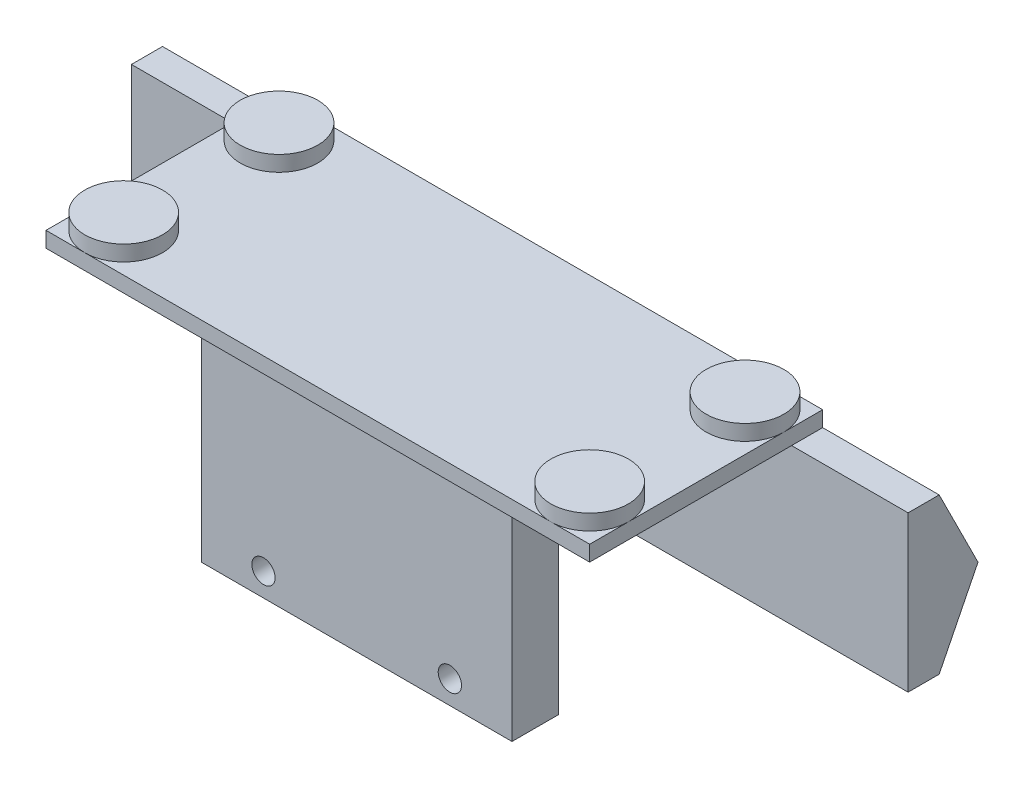
ISO-10303-21;
HEADER;
FILE_DESCRIPTION(('STEP AP214'),'2;1');
FILE_NAME('part.step','',(''),(''),'','','');
FILE_SCHEMA(('AUTOMOTIVE_DESIGN { 1 0 10303 214 1 1 1 1 }'));
ENDSEC;
DATA;
#1=APPLICATION_CONTEXT('core data for automotive mechanical design processes');
#2=APPLICATION_PROTOCOL_DEFINITION('international standard','automotive_design',2000,#1);
#3=PRODUCT_CONTEXT('',#1,'mechanical');
#4=PRODUCT('Part','Part','',(#3));
#5=PRODUCT_RELATED_PRODUCT_CATEGORY('part','',(#4));
#6=PRODUCT_DEFINITION_FORMATION('','',#4);
#7=PRODUCT_DEFINITION_CONTEXT('part definition',#1,'design');
#8=PRODUCT_DEFINITION('design','',#6,#7);
#9=PRODUCT_DEFINITION_SHAPE('','',#8);
#10=(LENGTH_UNIT() NAMED_UNIT(*) SI_UNIT(.MILLI.,.METRE.));
#11=(NAMED_UNIT(*) PLANE_ANGLE_UNIT() SI_UNIT($,.RADIAN.));
#12=(NAMED_UNIT(*) SI_UNIT($,.STERADIAN.) SOLID_ANGLE_UNIT());
#13=UNCERTAINTY_MEASURE_WITH_UNIT(LENGTH_MEASURE(1.E-05),#10,'distance_accuracy_value','');
#14=(GEOMETRIC_REPRESENTATION_CONTEXT(3) GLOBAL_UNCERTAINTY_ASSIGNED_CONTEXT((#13)) GLOBAL_UNIT_ASSIGNED_CONTEXT((#10,
#11,#12)) REPRESENTATION_CONTEXT('',''));
#15=CARTESIAN_POINT('',(0.,0.,0.));
#16=DIRECTION('',(0.,0.,1.));
#17=DIRECTION('',(1.,0.,0.));
#18=AXIS2_PLACEMENT_3D('',#15,#16,#17);
#19=CARTESIAN_POINT('',(85.,-20.,-26.));
#20=DIRECTION('',(0.,-1.,0.));
#21=DIRECTION('',(0.,0.,-1.));
#22=AXIS2_PLACEMENT_3D('',#19,#20,#21);
#23=PLANE('',#22);
#24=DIRECTION('',(0.,0.,1.));
#25=VECTOR('',#24,1.);
#26=CARTESIAN_POINT('',(48.076696830622,-20.,-35.001));
#27=LINE('',#26,#25);
#28=CARTESIAN_POINT('',(48.076696830622,-20.,-26.));
#29=VERTEX_POINT('',#28);
#30=CARTESIAN_POINT('',(48.076696830622,-20.,-30.));
#31=VERTEX_POINT('',#30);
#32=EDGE_CURVE('E191',#29,#31,#27,.F.);
#33=ORIENTED_EDGE('',*,*,#32,.T.);
#34=DIRECTION('',(-1.,0.,0.));
#35=VECTOR('',#34,1.);
#36=CARTESIAN_POINT('',(85.,-20.,-30.));
#37=LINE('',#36,#35);
#38=CARTESIAN_POINT('',(85.,-20.,-30.));
#39=VERTEX_POINT('',#38);
#40=EDGE_CURVE('E202',#39,#31,#37,.T.);
#41=ORIENTED_EDGE('',*,*,#40,.F.);
#42=DIRECTION('',(0.,0.,-1.));
#43=VECTOR('',#42,1.);
#44=CARTESIAN_POINT('',(85.,-20.,-26.));
#45=LINE('',#44,#43);
#46=CARTESIAN_POINT('',(85.,-20.,-26.));
#47=VERTEX_POINT('',#46);
#48=EDGE_CURVE('E231',#47,#39,#45,.T.);
#49=ORIENTED_EDGE('',*,*,#48,.F.);
#50=DIRECTION('',(-1.,0.,0.));
#51=VECTOR('',#50,1.);
#52=CARTESIAN_POINT('',(85.,-20.,-26.));
#53=LINE('',#52,#51);
#54=EDGE_CURVE('E205',#47,#29,#53,.T.);
#55=ORIENTED_EDGE('',*,*,#54,.T.);
#56=EDGE_LOOP('',(#33,#41,#49,#55));
#57=FACE_BOUND('',#56,.T.);
#58=ADVANCED_FACE('F43',(#57),#23,.T.);
#59=CARTESIAN_POINT('',(85.,-10.,-35.));
#60=DIRECTION('',(0.,-0.447213595499958,-0.894427190999916));
#61=DIRECTION('',(0.,0.894427190999916,-0.447213595499958));
#62=AXIS2_PLACEMENT_3D('',#59,#60,#61);
#63=PLANE('',#62);
#64=CARTESIAN_POINT('',(35.,-15.,-32.5));
#65=DIRECTION('',(0.,-0.447213595499958,-0.894427190999916));
#66=DIRECTION('',(0.,-0.894427190999916,0.447213595499958));
#67=AXIS2_PLACEMENT_3D('',#64,#65,#66);
#68=ELLIPSE('',#67,15.6524758424985,14.);
#69=CARTESIAN_POINT('',(21.923303169378,-10.,-35.));
#70=VERTEX_POINT('',#69);
#71=CARTESIAN_POINT('',(21.923303169378,-20.,-30.));
#72=VERTEX_POINT('',#71);
#73=EDGE_CURVE('E62',#70,#72,#68,.F.);
#74=ORIENTED_EDGE('',*,*,#73,.T.);
#75=CARTESIAN_POINT('',(-15.,-20.,-30.));
#76=VERTEX_POINT('',#75);
#77=EDGE_CURVE('E215',#72,#76,#37,.T.);
#78=ORIENTED_EDGE('',*,*,#77,.T.);
#79=DIRECTION('',(0.,-0.894427190999916,0.447213595499958));
#80=VECTOR('',#79,1.);
#81=CARTESIAN_POINT('',(-15.,-10.,-35.));
#82=LINE('',#81,#80);
#83=CARTESIAN_POINT('',(-15.,-10.,-35.));
#84=VERTEX_POINT('',#83);
#85=EDGE_CURVE('E356',#84,#76,#82,.T.);
#86=ORIENTED_EDGE('',*,*,#85,.F.);
#87=DIRECTION('',(-1.,0.,0.));
#88=VECTOR('',#87,1.);
#89=CARTESIAN_POINT('',(85.,-10.,-35.));
#90=LINE('',#89,#88);
#91=EDGE_CURVE('E351',#70,#84,#90,.T.);
#92=ORIENTED_EDGE('',*,*,#91,.F.);
#93=EDGE_LOOP('',(#74,#78,#86,#92));
#94=FACE_BOUND('',#93,.T.);
#95=ADVANCED_FACE('F506',(#94),#63,.T.);
#96=CARTESIAN_POINT('',(0.,0.,0.));
#97=DIRECTION('',(0.,-1.,0.));
#98=DIRECTION('',(0.,0.,-1.));
#99=AXIS2_PLACEMENT_3D('',#96,#97,#98);
#100=PLANE('',#99);
#101=DIRECTION('',(0.,0.,1.));
#102=VECTOR('',#101,1.);
#103=CARTESIAN_POINT('',(0.,0.,-30.));
#104=LINE('',#103,#102);
#105=CARTESIAN_POINT('',(0.,0.,-26.));
#106=VERTEX_POINT('',#105);
#107=CARTESIAN_POINT('',(0.,0.,0.));
#108=VERTEX_POINT('',#107);
#109=EDGE_CURVE('E302',#106,#108,#104,.T.);
#110=ORIENTED_EDGE('',*,*,#109,.F.);
#111=DIRECTION('',(1.,0.,0.));
#112=VECTOR('',#111,1.);
#113=CARTESIAN_POINT('',(85.,0.,-26.));
#114=LINE('',#113,#112);
#115=CARTESIAN_POINT('',(70.,0.,-26.));
#116=VERTEX_POINT('',#115);
#117=EDGE_CURVE('E11',#106,#116,#114,.T.);
#118=ORIENTED_EDGE('',*,*,#117,.T.);
#119=DIRECTION('',(0.,0.,-1.));
#120=VECTOR('',#119,1.);
#121=CARTESIAN_POINT('',(70.,0.,-30.));
#122=LINE('',#121,#120);
#123=CARTESIAN_POINT('',(70.,0.,0.));
#124=VERTEX_POINT('',#123);
#125=EDGE_CURVE('E306',#124,#116,#122,.T.);
#126=ORIENTED_EDGE('',*,*,#125,.F.);
#127=DIRECTION('',(1.,0.,0.));
#128=VECTOR('',#127,1.);
#129=CARTESIAN_POINT('',(0.,0.,0.));
#130=LINE('',#129,#128);
#131=EDGE_CURVE('E301',#108,#124,#130,.T.);
#132=ORIENTED_EDGE('',*,*,#131,.F.);
#133=EDGE_LOOP('',(#110,#118,#126,#132));
#134=FACE_BOUND('',#133,.T.);
#135=DIRECTION('',(0.,0.,-1.));
#136=VECTOR('',#135,1.);
#137=CARTESIAN_POINT('',(15.,0.,-5.));
#138=LINE('',#137,#136);
#139=CARTESIAN_POINT('',(15.,0.,-5.));
#140=VERTEX_POINT('',#139);
#141=CARTESIAN_POINT('',(15.,0.,-11.));
#142=VERTEX_POINT('',#141);
#143=EDGE_CURVE('E70',#140,#142,#138,.T.);
#144=ORIENTED_EDGE('',*,*,#143,.F.);
#145=DIRECTION('',(-1.,0.,0.));
#146=VECTOR('',#145,1.);
#147=CARTESIAN_POINT('',(15.,0.,-5.));
#148=LINE('',#147,#146);
#149=CARTESIAN_POINT('',(55.,0.,-5.));
#150=VERTEX_POINT('',#149);
#151=EDGE_CURVE('E459',#150,#140,#148,.T.);
#152=ORIENTED_EDGE('',*,*,#151,.F.);
#153=DIRECTION('',(0.,0.,-1.));
#154=VECTOR('',#153,1.);
#155=CARTESIAN_POINT('',(55.,0.,-5.));
#156=LINE('',#155,#154);
#157=CARTESIAN_POINT('',(55.,0.,-11.));
#158=VERTEX_POINT('',#157);
#159=EDGE_CURVE('E474',#150,#158,#156,.T.);
#160=ORIENTED_EDGE('',*,*,#159,.T.);
#161=DIRECTION('',(-1.,0.,0.));
#162=VECTOR('',#161,1.);
#163=CARTESIAN_POINT('',(15.,0.,-11.));
#164=LINE('',#163,#162);
#165=EDGE_CURVE('E455',#158,#142,#164,.T.);
#166=ORIENTED_EDGE('',*,*,#165,.T.);
#167=EDGE_LOOP('',(#144,#152,#160,#166));
#168=FACE_BOUND('',#167,.T.);
#169=ADVANCED_FACE('F382',(#134,#168),#100,.T.);
#170=CARTESIAN_POINT('',(0.,2.,0.));
#171=DIRECTION('',(0.,-1.,0.));
#172=DIRECTION('',(0.,0.,-1.));
#173=AXIS2_PLACEMENT_3D('',#170,#171,#172);
#174=PLANE('',#173);
#175=CARTESIAN_POINT('',(65.,2.,-5.));
#176=DIRECTION('',(0.,-1.,0.));
#177=DIRECTION('',(0.,0.,-1.));
#178=AXIS2_PLACEMENT_3D('',#175,#176,#177);
#179=CIRCLE('',#178,5.);
#180=CARTESIAN_POINT('',(65.,2.,0.));
#181=VERTEX_POINT('',#180);
#182=CARTESIAN_POINT('',(70.,2.,-5.));
#183=VERTEX_POINT('',#182);
#184=EDGE_CURVE('E245',#181,#183,#179,.F.);
#185=ORIENTED_EDGE('',*,*,#184,.F.);
#186=DIRECTION('',(1.,0.,0.));
#187=VECTOR('',#186,1.);
#188=CARTESIAN_POINT('',(0.,2.,0.));
#189=LINE('',#188,#187);
#190=CARTESIAN_POINT('',(70.,2.,0.));
#191=VERTEX_POINT('',#190);
#192=EDGE_CURVE('E283',#181,#191,#189,.T.);
#193=ORIENTED_EDGE('',*,*,#192,.T.);
#194=DIRECTION('',(0.,0.,-1.));
#195=VECTOR('',#194,1.);
#196=CARTESIAN_POINT('',(70.,2.,-30.));
#197=LINE('',#196,#195);
#198=EDGE_CURVE('E291',#191,#183,#197,.T.);
#199=ORIENTED_EDGE('',*,*,#198,.T.);
#200=EDGE_LOOP('',(#185,#193,#199));
#201=FACE_BOUND('',#200,.T.);
#202=ADVANCED_FACE('F528',(#201),#174,.F.);
#203=EDGE_CURVE('E241',#183,#181,#179,.F.);
#204=ORIENTED_EDGE('',*,*,#203,.F.);
#205=CARTESIAN_POINT('',(70.,2.,-25.));
#206=VERTEX_POINT('',#205);
#207=EDGE_CURVE('E296',#183,#206,#197,.T.);
#208=ORIENTED_EDGE('',*,*,#207,.T.);
#209=CARTESIAN_POINT('',(65.,2.,-25.));
#210=DIRECTION('',(0.,-1.,0.));
#211=DIRECTION('',(0.,0.,-1.));
#212=AXIS2_PLACEMENT_3D('',#209,#210,#211);
#213=CIRCLE('',#212,5.);
#214=CARTESIAN_POINT('',(65.,2.,-30.));
#215=VERTEX_POINT('',#214);
#216=EDGE_CURVE('E254',#215,#206,#213,.F.);
#217=ORIENTED_EDGE('',*,*,#216,.F.);
#218=DIRECTION('',(-1.,0.,0.));
#219=VECTOR('',#218,1.);
#220=CARTESIAN_POINT('',(0.,2.,-30.));
#221=LINE('',#220,#219);
#222=CARTESIAN_POINT('',(5.,2.,-30.));
#223=VERTEX_POINT('',#222);
#224=EDGE_CURVE('E277',#215,#223,#221,.T.);
#225=ORIENTED_EDGE('',*,*,#224,.T.);
#226=CARTESIAN_POINT('',(5.,2.,-25.));
#227=DIRECTION('',(0.,-1.,0.));
#228=DIRECTION('',(0.,0.,-1.));
#229=AXIS2_PLACEMENT_3D('',#226,#227,#228);
#230=CIRCLE('',#229,5.);
#231=CARTESIAN_POINT('',(0.,2.,-25.));
#232=VERTEX_POINT('',#231);
#233=EDGE_CURVE('E268',#232,#223,#230,.F.);
#234=ORIENTED_EDGE('',*,*,#233,.F.);
#235=DIRECTION('',(0.,0.,1.));
#236=VECTOR('',#235,1.);
#237=CARTESIAN_POINT('',(0.,2.,-30.));
#238=LINE('',#237,#236);
#239=CARTESIAN_POINT('',(0.,2.,-5.));
#240=VERTEX_POINT('',#239);
#241=EDGE_CURVE('E284',#232,#240,#238,.T.);
#242=ORIENTED_EDGE('',*,*,#241,.T.);
#243=CARTESIAN_POINT('',(5.,2.,-5.));
#244=DIRECTION('',(0.,-1.,0.));
#245=DIRECTION('',(0.,0.,-1.));
#246=AXIS2_PLACEMENT_3D('',#243,#244,#245);
#247=CIRCLE('',#246,5.);
#248=CARTESIAN_POINT('',(5.,2.,0.));
#249=VERTEX_POINT('',#248);
#250=EDGE_CURVE('E259',#249,#240,#247,.F.);
#251=ORIENTED_EDGE('',*,*,#250,.F.);
#252=EDGE_CURVE('E290',#249,#181,#189,.T.);
#253=ORIENTED_EDGE('',*,*,#252,.T.);
#254=EDGE_LOOP('',(#204,#208,#217,#225,#234,#242,#251,#253));
#255=FACE_BOUND('',#254,.T.);
#256=ADVANCED_FACE('F397',(#255),#174,.F.);
#257=EDGE_CURVE('E263',#240,#249,#247,.F.);
#258=ORIENTED_EDGE('',*,*,#257,.F.);
#259=CARTESIAN_POINT('',(0.,2.,0.));
#260=VERTEX_POINT('',#259);
#261=EDGE_CURVE('E276',#240,#260,#238,.T.);
#262=ORIENTED_EDGE('',*,*,#261,.T.);
#263=EDGE_CURVE('E285',#260,#249,#189,.T.);
#264=ORIENTED_EDGE('',*,*,#263,.T.);
#265=EDGE_LOOP('',(#258,#262,#264));
#266=FACE_BOUND('',#265,.T.);
#267=ADVANCED_FACE('F859',(#266),#174,.F.);
#268=EDGE_CURVE('E272',#223,#232,#230,.F.);
#269=ORIENTED_EDGE('',*,*,#268,.F.);
#270=CARTESIAN_POINT('',(0.,2.,-30.));
#271=VERTEX_POINT('',#270);
#272=EDGE_CURVE('E278',#223,#271,#221,.T.);
#273=ORIENTED_EDGE('',*,*,#272,.T.);
#274=EDGE_CURVE('E279',#271,#232,#238,.T.);
#275=ORIENTED_EDGE('',*,*,#274,.T.);
#276=EDGE_LOOP('',(#269,#273,#275));
#277=FACE_BOUND('',#276,.T.);
#278=ADVANCED_FACE('F391',(#277),#174,.F.);
#279=CARTESIAN_POINT('',(0.,2.,-30.));
#280=DIRECTION('',(0.,0.,1.));
#281=DIRECTION('',(1.,0.,0.));
#282=AXIS2_PLACEMENT_3D('',#279,#280,#281);
#283=PLANE('',#282);
#284=DIRECTION('',(0.,-1.,0.));
#285=VECTOR('',#284,1.);
#286=CARTESIAN_POINT('',(70.,2.,-30.));
#287=LINE('',#286,#285);
#288=CARTESIAN_POINT('',(70.,2.,-30.));
#289=VERTEX_POINT('',#288);
#290=CARTESIAN_POINT('',(70.,0.,-30.));
#291=VERTEX_POINT('',#290);
#292=EDGE_CURVE('E295',#289,#291,#287,.T.);
#293=ORIENTED_EDGE('',*,*,#292,.T.);
#294=DIRECTION('',(-1.,0.,0.));
#295=VECTOR('',#294,1.);
#296=CARTESIAN_POINT('',(85.,0.,-30.));
#297=LINE('',#296,#295);
#298=CARTESIAN_POINT('',(0.,0.,-30.));
#299=VERTEX_POINT('',#298);
#300=EDGE_CURVE('E340',#291,#299,#297,.T.);
#301=ORIENTED_EDGE('',*,*,#300,.T.);
#302=DIRECTION('',(0.,-1.,0.));
#303=VECTOR('',#302,1.);
#304=CARTESIAN_POINT('',(0.,2.,-30.));
#305=LINE('',#304,#303);
#306=EDGE_CURVE('E47',#271,#299,#305,.T.);
#307=ORIENTED_EDGE('',*,*,#306,.F.);
#308=ORIENTED_EDGE('',*,*,#272,.F.);
#309=ORIENTED_EDGE('',*,*,#224,.F.);
#310=EDGE_CURVE('E273',#289,#215,#221,.T.);
#311=ORIENTED_EDGE('',*,*,#310,.F.);
#312=EDGE_LOOP('',(#293,#301,#307,#308,#309,#311));
#313=FACE_BOUND('',#312,.T.);
#314=ADVANCED_FACE('F45',(#313),#283,.F.);
#315=CARTESIAN_POINT('',(0.,2.,-30.));
#316=DIRECTION('',(1.,0.,0.));
#317=DIRECTION('',(0.,0.,-1.));
#318=AXIS2_PLACEMENT_3D('',#315,#316,#317);
#319=PLANE('',#318);
#320=EDGE_CURVE('E297',#299,#106,#104,.T.);
#321=ORIENTED_EDGE('',*,*,#320,.T.);
#322=ORIENTED_EDGE('',*,*,#109,.T.);
#323=DIRECTION('',(0.,-1.,0.));
#324=VECTOR('',#323,1.);
#325=CARTESIAN_POINT('',(0.,2.,0.));
#326=LINE('',#325,#324);
#327=EDGE_CURVE('E316',#260,#108,#326,.T.);
#328=ORIENTED_EDGE('',*,*,#327,.F.);
#329=ORIENTED_EDGE('',*,*,#261,.F.);
#330=ORIENTED_EDGE('',*,*,#241,.F.);
#331=ORIENTED_EDGE('',*,*,#274,.F.);
#332=ORIENTED_EDGE('',*,*,#306,.T.);
#333=EDGE_LOOP('',(#321,#322,#328,#329,#330,#331,#332));
#334=FACE_BOUND('',#333,.T.);
#335=ADVANCED_FACE('F329',(#334),#319,.F.);
#336=CARTESIAN_POINT('',(0.,2.,0.));
#337=DIRECTION('',(0.,0.,-1.));
#338=DIRECTION('',(-1.,0.,0.));
#339=AXIS2_PLACEMENT_3D('',#336,#337,#338);
#340=PLANE('',#339);
#341=ORIENTED_EDGE('',*,*,#131,.T.);
#342=DIRECTION('',(0.,-1.,0.));
#343=VECTOR('',#342,1.);
#344=CARTESIAN_POINT('',(70.,2.,0.));
#345=LINE('',#344,#343);
#346=EDGE_CURVE('E313',#191,#124,#345,.T.);
#347=ORIENTED_EDGE('',*,*,#346,.F.);
#348=ORIENTED_EDGE('',*,*,#192,.F.);
#349=ORIENTED_EDGE('',*,*,#252,.F.);
#350=ORIENTED_EDGE('',*,*,#263,.F.);
#351=ORIENTED_EDGE('',*,*,#327,.T.);
#352=EDGE_LOOP('',(#341,#347,#348,#349,#350,#351));
#353=FACE_BOUND('',#352,.T.);
#354=ADVANCED_FACE('F889',(#353),#340,.F.);
#355=CARTESIAN_POINT('',(70.,2.,-30.));
#356=DIRECTION('',(-1.,0.,0.));
#357=DIRECTION('',(0.,0.,1.));
#358=AXIS2_PLACEMENT_3D('',#355,#356,#357);
#359=PLANE('',#358);
#360=ORIENTED_EDGE('',*,*,#125,.T.);
#361=EDGE_CURVE('E305',#116,#291,#122,.T.);
#362=ORIENTED_EDGE('',*,*,#361,.T.);
#363=ORIENTED_EDGE('',*,*,#292,.F.);
#364=EDGE_CURVE('E289',#206,#289,#197,.T.);
#365=ORIENTED_EDGE('',*,*,#364,.F.);
#366=ORIENTED_EDGE('',*,*,#207,.F.);
#367=ORIENTED_EDGE('',*,*,#198,.F.);
#368=ORIENTED_EDGE('',*,*,#346,.T.);
#369=EDGE_LOOP('',(#360,#362,#363,#365,#366,#367,#368));
#370=FACE_BOUND('',#369,.T.);
#371=ADVANCED_FACE('F409',(#370),#359,.F.);
#372=EDGE_CURVE('E250',#206,#215,#213,.F.);
#373=ORIENTED_EDGE('',*,*,#372,.F.);
#374=ORIENTED_EDGE('',*,*,#364,.T.);
#375=ORIENTED_EDGE('',*,*,#310,.T.);
#376=EDGE_LOOP('',(#373,#374,#375));
#377=FACE_BOUND('',#376,.T.);
#378=ADVANCED_FACE('F403',(#377),#174,.F.);
#379=CARTESIAN_POINT('',(5.,4.,-25.));
#380=DIRECTION('',(0.,-1.,0.));
#381=DIRECTION('',(0.,0.,-1.));
#382=AXIS2_PLACEMENT_3D('',#379,#380,#381);
#383=CYLINDRICAL_SURFACE('',#382,5.);
#384=CARTESIAN_POINT('',(5.,4.,-25.));
#385=DIRECTION('',(0.,1.,0.));
#386=DIRECTION('',(0.,0.,1.));
#387=AXIS2_PLACEMENT_3D('',#384,#385,#386);
#388=CIRCLE('',#387,5.);
#389=CARTESIAN_POINT('',(5.,4.,-20.));
#390=VERTEX_POINT('',#389);
#391=EDGE_CURVE('E264',#390,#390,#388,.T.);
#392=ORIENTED_EDGE('',*,*,#391,.F.);
#393=EDGE_LOOP('',(#392));
#394=FACE_BOUND('',#393,.T.);
#395=ORIENTED_EDGE('',*,*,#233,.T.);
#396=ORIENTED_EDGE('',*,*,#268,.T.);
#397=EDGE_LOOP('',(#395,#396));
#398=FACE_BOUND('',#397,.T.);
#399=ADVANCED_FACE('F389',(#394,#398),#383,.T.);
#400=CARTESIAN_POINT('',(5.,4.,-25.));
#401=DIRECTION('',(0.,1.,0.));
#402=DIRECTION('',(0.,0.,1.));
#403=AXIS2_PLACEMENT_3D('',#400,#401,#402);
#404=PLANE('',#403);
#405=ORIENTED_EDGE('',*,*,#391,.T.);
#406=EDGE_LOOP('',(#405));
#407=FACE_BOUND('',#406,.T.);
#408=ADVANCED_FACE('F818',(#407),#404,.T.);
#409=CARTESIAN_POINT('',(5.,4.,-5.));
#410=DIRECTION('',(0.,-1.,0.));
#411=DIRECTION('',(0.,0.,-1.));
#412=AXIS2_PLACEMENT_3D('',#409,#410,#411);
#413=CYLINDRICAL_SURFACE('',#412,5.);
#414=CARTESIAN_POINT('',(5.,4.,-5.));
#415=DIRECTION('',(0.,1.,0.));
#416=DIRECTION('',(0.,0.,1.));
#417=AXIS2_PLACEMENT_3D('',#414,#415,#416);
#418=CIRCLE('',#417,5.);
#419=CARTESIAN_POINT('',(5.,4.,0.));
#420=VERTEX_POINT('',#419);
#421=EDGE_CURVE('E255',#420,#420,#418,.T.);
#422=ORIENTED_EDGE('',*,*,#421,.F.);
#423=EDGE_LOOP('',(#422));
#424=FACE_BOUND('',#423,.T.);
#425=ORIENTED_EDGE('',*,*,#250,.T.);
#426=ORIENTED_EDGE('',*,*,#257,.T.);
#427=EDGE_LOOP('',(#425,#426));
#428=FACE_BOUND('',#427,.T.);
#429=ADVANCED_FACE('F807',(#424,#428),#413,.T.);
#430=CARTESIAN_POINT('',(5.,4.,-5.));
#431=DIRECTION('',(0.,1.,0.));
#432=DIRECTION('',(0.,0.,1.));
#433=AXIS2_PLACEMENT_3D('',#430,#431,#432);
#434=PLANE('',#433);
#435=ORIENTED_EDGE('',*,*,#421,.T.);
#436=EDGE_LOOP('',(#435));
#437=FACE_BOUND('',#436,.T.);
#438=ADVANCED_FACE('F796',(#437),#434,.T.);
#439=CARTESIAN_POINT('',(65.,4.,-25.));
#440=DIRECTION('',(0.,-1.,0.));
#441=DIRECTION('',(0.,0.,-1.));
#442=AXIS2_PLACEMENT_3D('',#439,#440,#441);
#443=CYLINDRICAL_SURFACE('',#442,5.);
#444=CARTESIAN_POINT('',(65.,4.,-25.));
#445=DIRECTION('',(0.,1.,0.));
#446=DIRECTION('',(0.,0.,1.));
#447=AXIS2_PLACEMENT_3D('',#444,#445,#446);
#448=CIRCLE('',#447,5.);
#449=CARTESIAN_POINT('',(65.,4.,-20.));
#450=VERTEX_POINT('',#449);
#451=EDGE_CURVE('E246',#450,#450,#448,.T.);
#452=ORIENTED_EDGE('',*,*,#451,.F.);
#453=EDGE_LOOP('',(#452));
#454=FACE_BOUND('',#453,.T.);
#455=ORIENTED_EDGE('',*,*,#372,.T.);
#456=ORIENTED_EDGE('',*,*,#216,.T.);
#457=EDGE_LOOP('',(#455,#456));
#458=FACE_BOUND('',#457,.T.);
#459=ADVANCED_FACE('F785',(#454,#458),#443,.T.);
#460=CARTESIAN_POINT('',(65.,4.,-25.));
#461=DIRECTION('',(0.,1.,0.));
#462=DIRECTION('',(0.,0.,1.));
#463=AXIS2_PLACEMENT_3D('',#460,#461,#462);
#464=PLANE('',#463);
#465=ORIENTED_EDGE('',*,*,#451,.T.);
#466=EDGE_LOOP('',(#465));
#467=FACE_BOUND('',#466,.T.);
#468=ADVANCED_FACE('F774',(#467),#464,.T.);
#469=CARTESIAN_POINT('',(65.,4.,-5.));
#470=DIRECTION('',(0.,-1.,0.));
#471=DIRECTION('',(0.,0.,-1.));
#472=AXIS2_PLACEMENT_3D('',#469,#470,#471);
#473=CYLINDRICAL_SURFACE('',#472,5.);
#474=CARTESIAN_POINT('',(65.,4.,-5.));
#475=DIRECTION('',(0.,1.,0.));
#476=DIRECTION('',(0.,0.,1.));
#477=AXIS2_PLACEMENT_3D('',#474,#475,#476);
#478=CIRCLE('',#477,5.);
#479=CARTESIAN_POINT('',(65.,4.,0.));
#480=VERTEX_POINT('',#479);
#481=EDGE_CURVE('E226',#480,#480,#478,.T.);
#482=ORIENTED_EDGE('',*,*,#481,.F.);
#483=EDGE_LOOP('',(#482));
#484=FACE_BOUND('',#483,.T.);
#485=ORIENTED_EDGE('',*,*,#203,.T.);
#486=ORIENTED_EDGE('',*,*,#184,.T.);
#487=EDGE_LOOP('',(#485,#486));
#488=FACE_BOUND('',#487,.T.);
#489=ADVANCED_FACE('F763',(#484,#488),#473,.T.);
#490=CARTESIAN_POINT('',(65.,4.,-5.));
#491=DIRECTION('',(0.,1.,0.));
#492=DIRECTION('',(0.,0.,1.));
#493=AXIS2_PLACEMENT_3D('',#490,#491,#492);
#494=PLANE('',#493);
#495=ORIENTED_EDGE('',*,*,#481,.T.);
#496=EDGE_LOOP('',(#495));
#497=FACE_BOUND('',#496,.T.);
#498=ADVANCED_FACE('F741',(#497),#494,.T.);
#499=CARTESIAN_POINT('',(85.,0.,-26.));
#500=DIRECTION('',(0.,1.,0.));
#501=DIRECTION('',(0.,0.,1.));
#502=AXIS2_PLACEMENT_3D('',#499,#500,#501);
#503=PLANE('',#502);
#504=ORIENTED_EDGE('',*,*,#361,.F.);
#505=CARTESIAN_POINT('',(85.,0.,-26.));
#506=VERTEX_POINT('',#505);
#507=EDGE_CURVE('E55',#116,#506,#114,.T.);
#508=ORIENTED_EDGE('',*,*,#507,.T.);
#509=DIRECTION('',(0.,0.,-1.));
#510=VECTOR('',#509,1.);
#511=CARTESIAN_POINT('',(85.,0.,-26.));
#512=LINE('',#511,#510);
#513=CARTESIAN_POINT('',(85.,0.,-30.));
#514=VERTEX_POINT('',#513);
#515=EDGE_CURVE('E234',#506,#514,#512,.T.);
#516=ORIENTED_EDGE('',*,*,#515,.T.);
#517=DIRECTION('',(1.,0.,0.));
#518=VECTOR('',#517,1.);
#519=CARTESIAN_POINT('',(85.,0.,-30.));
#520=LINE('',#519,#518);
#521=EDGE_CURVE('E345',#291,#514,#520,.T.);
#522=ORIENTED_EDGE('',*,*,#521,.F.);
#523=EDGE_LOOP('',(#504,#508,#516,#522));
#524=FACE_BOUND('',#523,.T.);
#525=ADVANCED_FACE('F413',(#524),#503,.T.);
#526=ORIENTED_EDGE('',*,*,#320,.F.);
#527=CARTESIAN_POINT('',(-15.,0.,-30.));
#528=VERTEX_POINT('',#527);
#529=EDGE_CURVE('E219',#528,#299,#520,.T.);
#530=ORIENTED_EDGE('',*,*,#529,.F.);
#531=DIRECTION('',(0.,0.,-1.));
#532=VECTOR('',#531,1.);
#533=CARTESIAN_POINT('',(-15.,0.,-26.));
#534=LINE('',#533,#532);
#535=CARTESIAN_POINT('',(-15.,0.,-26.));
#536=VERTEX_POINT('',#535);
#537=EDGE_CURVE('E223',#536,#528,#534,.T.);
#538=ORIENTED_EDGE('',*,*,#537,.F.);
#539=EDGE_CURVE('E54',#536,#106,#114,.T.);
#540=ORIENTED_EDGE('',*,*,#539,.T.);
#541=EDGE_LOOP('',(#526,#530,#538,#540));
#542=FACE_BOUND('',#541,.T.);
#543=ADVANCED_FACE('F380',(#542),#503,.T.);
#544=CARTESIAN_POINT('',(-15.,0.,-26.));
#545=DIRECTION('',(-1.,0.,0.));
#546=DIRECTION('',(0.,0.,1.));
#547=AXIS2_PLACEMENT_3D('',#544,#545,#546);
#548=PLANE('',#547);
#549=ORIENTED_EDGE('',*,*,#537,.T.);
#550=DIRECTION('',(0.,-0.894427190999916,-0.447213595499958));
#551=VECTOR('',#550,1.);
#552=CARTESIAN_POINT('',(-15.,0.,-30.));
#553=LINE('',#552,#551);
#554=EDGE_CURVE('E342',#528,#84,#553,.T.);
#555=ORIENTED_EDGE('',*,*,#554,.T.);
#556=ORIENTED_EDGE('',*,*,#85,.T.);
#557=DIRECTION('',(0.,0.,-1.));
#558=VECTOR('',#557,1.);
#559=CARTESIAN_POINT('',(-15.,-20.,-26.));
#560=LINE('',#559,#558);
#561=CARTESIAN_POINT('',(-15.,-20.,-26.));
#562=VERTEX_POINT('',#561);
#563=EDGE_CURVE('E227',#562,#76,#560,.T.);
#564=ORIENTED_EDGE('',*,*,#563,.F.);
#565=DIRECTION('',(0.,1.,0.));
#566=VECTOR('',#565,1.);
#567=CARTESIAN_POINT('',(-15.,0.,-26.));
#568=LINE('',#567,#566);
#569=EDGE_CURVE('E237',#562,#536,#568,.T.);
#570=ORIENTED_EDGE('',*,*,#569,.T.);
#571=EDGE_LOOP('',(#549,#555,#556,#564,#570));
#572=FACE_BOUND('',#571,.T.);
#573=ADVANCED_FACE('F373',(#572),#548,.T.);
#574=DIRECTION('',(0.,0.,1.));
#575=VECTOR('',#574,1.);
#576=CARTESIAN_POINT('',(21.923303169378,-20.,-35.001));
#577=LINE('',#576,#575);
#578=CARTESIAN_POINT('',(21.923303169378,-20.,-26.));
#579=VERTEX_POINT('',#578);
#580=EDGE_CURVE('E208',#72,#579,#577,.T.);
#581=ORIENTED_EDGE('',*,*,#580,.T.);
#582=EDGE_CURVE('E366',#579,#562,#53,.T.);
#583=ORIENTED_EDGE('',*,*,#582,.T.);
#584=ORIENTED_EDGE('',*,*,#563,.T.);
#585=ORIENTED_EDGE('',*,*,#77,.F.);
#586=EDGE_LOOP('',(#581,#583,#584,#585));
#587=FACE_BOUND('',#586,.T.);
#588=ADVANCED_FACE('F509',(#587),#23,.T.);
#589=CARTESIAN_POINT('',(85.,0.,-26.));
#590=DIRECTION('',(1.,0.,0.));
#591=DIRECTION('',(0.,0.,-1.));
#592=AXIS2_PLACEMENT_3D('',#589,#590,#591);
#593=PLANE('',#592);
#594=ORIENTED_EDGE('',*,*,#48,.T.);
#595=DIRECTION('',(0.,-0.894427190999916,0.447213595499958));
#596=VECTOR('',#595,1.);
#597=CARTESIAN_POINT('',(85.,-10.,-35.));
#598=LINE('',#597,#596);
#599=CARTESIAN_POINT('',(85.,-10.,-35.));
#600=VERTEX_POINT('',#599);
#601=EDGE_CURVE('E213',#600,#39,#598,.T.);
#602=ORIENTED_EDGE('',*,*,#601,.F.);
#603=DIRECTION('',(0.,-0.894427190999916,-0.447213595499958));
#604=VECTOR('',#603,1.);
#605=CARTESIAN_POINT('',(85.,0.,-30.));
#606=LINE('',#605,#604);
#607=EDGE_CURVE('E418',#514,#600,#606,.T.);
#608=ORIENTED_EDGE('',*,*,#607,.F.);
#609=ORIENTED_EDGE('',*,*,#515,.F.);
#610=DIRECTION('',(0.,-1.,0.));
#611=VECTOR('',#610,1.);
#612=CARTESIAN_POINT('',(85.,0.,-26.));
#613=LINE('',#612,#611);
#614=EDGE_CURVE('E362',#506,#47,#613,.T.);
#615=ORIENTED_EDGE('',*,*,#614,.T.);
#616=EDGE_LOOP('',(#594,#602,#608,#609,#615));
#617=FACE_BOUND('',#616,.T.);
#618=ADVANCED_FACE('F417',(#617),#593,.T.);
#619=CARTESIAN_POINT('',(0.,0.,-26.));
#620=DIRECTION('',(0.,0.,1.));
#621=DIRECTION('',(1.,0.,0.));
#622=AXIS2_PLACEMENT_3D('',#619,#620,#621);
#623=PLANE('',#622);
#624=CARTESIAN_POINT('',(35.,-15.,-26.));
#625=DIRECTION('',(0.,0.,1.));
#626=DIRECTION('',(1.,0.,0.));
#627=AXIS2_PLACEMENT_3D('',#624,#625,#626);
#628=CIRCLE('',#627,14.);
#629=EDGE_CURVE('E207',#29,#579,#628,.T.);
#630=ORIENTED_EDGE('',*,*,#629,.F.);
#631=ORIENTED_EDGE('',*,*,#54,.F.);
#632=ORIENTED_EDGE('',*,*,#614,.F.);
#633=ORIENTED_EDGE('',*,*,#507,.F.);
#634=ORIENTED_EDGE('',*,*,#117,.F.);
#635=ORIENTED_EDGE('',*,*,#539,.F.);
#636=ORIENTED_EDGE('',*,*,#569,.F.);
#637=ORIENTED_EDGE('',*,*,#582,.F.);
#638=EDGE_LOOP('',(#630,#631,#632,#633,#634,#635,#636,#637));
#639=FACE_BOUND('',#638,.T.);
#640=ADVANCED_FACE('F378',(#639),#623,.T.);
#641=CARTESIAN_POINT('',(48.076696830622,-10.,-35.));
#642=VERTEX_POINT('',#641);
#643=EDGE_CURVE('E188',#31,#642,#68,.F.);
#644=ORIENTED_EDGE('',*,*,#643,.T.);
#645=EDGE_CURVE('E347',#600,#642,#90,.T.);
#646=ORIENTED_EDGE('',*,*,#645,.F.);
#647=ORIENTED_EDGE('',*,*,#601,.T.);
#648=ORIENTED_EDGE('',*,*,#40,.T.);
#649=EDGE_LOOP('',(#644,#646,#647,#648));
#650=FACE_BOUND('',#649,.T.);
#651=ADVANCED_FACE('F211',(#650),#63,.T.);
#652=CARTESIAN_POINT('',(85.,0.,-30.));
#653=DIRECTION('',(0.,0.447213595499958,-0.894427190999916));
#654=DIRECTION('',(0.,0.894427190999916,0.447213595499958));
#655=AXIS2_PLACEMENT_3D('',#652,#653,#654);
#656=PLANE('',#655);
#657=CARTESIAN_POINT('',(35.,-15.,-37.5));
#658=DIRECTION('',(0.,0.447213595499958,-0.894427190999916));
#659=DIRECTION('',(0.,0.894427190999916,0.447213595499958));
#660=AXIS2_PLACEMENT_3D('',#657,#658,#659);
#661=ELLIPSE('',#660,15.6524758424985,14.);
#662=EDGE_CURVE('E193',#642,#70,#661,.F.);
#663=ORIENTED_EDGE('',*,*,#662,.T.);
#664=ORIENTED_EDGE('',*,*,#91,.T.);
#665=ORIENTED_EDGE('',*,*,#554,.F.);
#666=ORIENTED_EDGE('',*,*,#529,.T.);
#667=ORIENTED_EDGE('',*,*,#300,.F.);
#668=ORIENTED_EDGE('',*,*,#521,.T.);
#669=ORIENTED_EDGE('',*,*,#607,.T.);
#670=ORIENTED_EDGE('',*,*,#645,.T.);
#671=EDGE_LOOP('',(#663,#664,#665,#666,#667,#668,#669,#670));
#672=FACE_BOUND('',#671,.T.);
#673=ADVANCED_FACE('F338',(#672),#656,.T.);
#674=CARTESIAN_POINT('',(15.,0.,-5.));
#675=DIRECTION('',(1.,0.,0.));
#676=DIRECTION('',(0.,0.,-1.));
#677=AXIS2_PLACEMENT_3D('',#674,#675,#676);
#678=PLANE('',#677);
#679=DIRECTION('',(0.,-1.,0.));
#680=VECTOR('',#679,1.);
#681=CARTESIAN_POINT('',(15.,0.,-11.));
#682=LINE('',#681,#680);
#683=CARTESIAN_POINT('',(15.,-30.,-11.));
#684=VERTEX_POINT('',#683);
#685=EDGE_CURVE('E477',#142,#684,#682,.T.);
#686=ORIENTED_EDGE('',*,*,#685,.T.);
#687=DIRECTION('',(0.,0.,-1.));
#688=VECTOR('',#687,1.);
#689=CARTESIAN_POINT('',(15.,-30.,-5.));
#690=LINE('',#689,#688);
#691=CARTESIAN_POINT('',(15.,-30.,-5.));
#692=VERTEX_POINT('',#691);
#693=EDGE_CURVE('E492',#692,#684,#690,.T.);
#694=ORIENTED_EDGE('',*,*,#693,.F.);
#695=DIRECTION('',(0.,-1.,0.));
#696=VECTOR('',#695,1.);
#697=CARTESIAN_POINT('',(15.,0.,-5.));
#698=LINE('',#697,#696);
#699=EDGE_CURVE('E463',#140,#692,#698,.T.);
#700=ORIENTED_EDGE('',*,*,#699,.F.);
#701=ORIENTED_EDGE('',*,*,#143,.T.);
#702=EDGE_LOOP('',(#686,#694,#700,#701));
#703=FACE_BOUND('',#702,.T.);
#704=ADVANCED_FACE('F537',(#703),#678,.F.);
#705=CARTESIAN_POINT('',(15.,-30.,-5.));
#706=DIRECTION('',(0.,1.,0.));
#707=DIRECTION('',(-1.,0.,0.));
#708=AXIS2_PLACEMENT_3D('',#705,#706,#707);
#709=PLANE('',#708);
#710=DIRECTION('',(1.,0.,0.));
#711=VECTOR('',#710,1.);
#712=CARTESIAN_POINT('',(15.,-30.,-11.));
#713=LINE('',#712,#711);
#714=CARTESIAN_POINT('',(55.,-30.,-11.));
#715=VERTEX_POINT('',#714);
#716=EDGE_CURVE('E480',#684,#715,#713,.T.);
#717=ORIENTED_EDGE('',*,*,#716,.T.);
#718=DIRECTION('',(0.,0.,-1.));
#719=VECTOR('',#718,1.);
#720=CARTESIAN_POINT('',(55.,-30.,-5.));
#721=LINE('',#720,#719);
#722=CARTESIAN_POINT('',(55.,-30.,-5.));
#723=VERTEX_POINT('',#722);
#724=EDGE_CURVE('E488',#723,#715,#721,.T.);
#725=ORIENTED_EDGE('',*,*,#724,.F.);
#726=DIRECTION('',(1.,0.,0.));
#727=VECTOR('',#726,1.);
#728=CARTESIAN_POINT('',(15.,-30.,-5.));
#729=LINE('',#728,#727);
#730=EDGE_CURVE('E467',#692,#723,#729,.T.);
#731=ORIENTED_EDGE('',*,*,#730,.F.);
#732=ORIENTED_EDGE('',*,*,#693,.T.);
#733=EDGE_LOOP('',(#717,#725,#731,#732));
#734=FACE_BOUND('',#733,.T.);
#735=ADVANCED_FACE('F569',(#734),#709,.F.);
#736=CARTESIAN_POINT('',(55.,0.,-5.));
#737=DIRECTION('',(-1.,0.,0.));
#738=DIRECTION('',(0.,0.,1.));
#739=AXIS2_PLACEMENT_3D('',#736,#737,#738);
#740=PLANE('',#739);
#741=DIRECTION('',(0.,1.,0.));
#742=VECTOR('',#741,1.);
#743=CARTESIAN_POINT('',(55.,0.,-11.));
#744=LINE('',#743,#742);
#745=EDGE_CURVE('E464',#715,#158,#744,.T.);
#746=ORIENTED_EDGE('',*,*,#745,.T.);
#747=ORIENTED_EDGE('',*,*,#159,.F.);
#748=DIRECTION('',(0.,1.,0.));
#749=VECTOR('',#748,1.);
#750=CARTESIAN_POINT('',(55.,0.,-5.));
#751=LINE('',#750,#749);
#752=EDGE_CURVE('E470',#723,#150,#751,.T.);
#753=ORIENTED_EDGE('',*,*,#752,.F.);
#754=ORIENTED_EDGE('',*,*,#724,.T.);
#755=EDGE_LOOP('',(#746,#747,#753,#754));
#756=FACE_BOUND('',#755,.T.);
#757=ADVANCED_FACE('F579',(#756),#740,.F.);
#758=CARTESIAN_POINT('',(0.,0.,-5.));
#759=DIRECTION('',(0.,0.,-1.));
#760=DIRECTION('',(-1.,0.,0.));
#761=AXIS2_PLACEMENT_3D('',#758,#759,#760);
#762=PLANE('',#761);
#763=CARTESIAN_POINT('',(47.,-3.,-5.));
#764=DIRECTION('',(0.,0.,1.));
#765=DIRECTION('',(1.,0.,0.));
#766=AXIS2_PLACEMENT_3D('',#763,#764,#765);
#767=CIRCLE('',#766,1.5);
#768=CARTESIAN_POINT('',(48.5,-3.,-5.));
#769=VERTEX_POINT('',#768);
#770=EDGE_CURVE('E440',#769,#769,#767,.T.);
#771=ORIENTED_EDGE('',*,*,#770,.F.);
#772=EDGE_LOOP('',(#771));
#773=FACE_BOUND('',#772,.T.);
#774=CARTESIAN_POINT('',(23.,-27.,-5.));
#775=DIRECTION('',(0.,0.,1.));
#776=DIRECTION('',(1.,0.,0.));
#777=AXIS2_PLACEMENT_3D('',#774,#775,#776);
#778=CIRCLE('',#777,1.5);
#779=CARTESIAN_POINT('',(24.5,-27.,-5.));
#780=VERTEX_POINT('',#779);
#781=EDGE_CURVE('E431',#780,#780,#778,.T.);
#782=ORIENTED_EDGE('',*,*,#781,.F.);
#783=EDGE_LOOP('',(#782));
#784=FACE_BOUND('',#783,.T.);
#785=CARTESIAN_POINT('',(47.,-27.,-5.));
#786=DIRECTION('',(0.,0.,1.));
#787=DIRECTION('',(1.,0.,0.));
#788=AXIS2_PLACEMENT_3D('',#785,#786,#787);
#789=CIRCLE('',#788,1.5);
#790=CARTESIAN_POINT('',(48.5,-27.,-5.));
#791=VERTEX_POINT('',#790);
#792=EDGE_CURVE('E198',#791,#791,#789,.T.);
#793=ORIENTED_EDGE('',*,*,#792,.F.);
#794=EDGE_LOOP('',(#793));
#795=FACE_BOUND('',#794,.T.);
#796=CARTESIAN_POINT('',(23.,-3.,-5.));
#797=DIRECTION('',(0.,0.,1.));
#798=DIRECTION('',(1.,0.,0.));
#799=AXIS2_PLACEMENT_3D('',#796,#797,#798);
#800=CIRCLE('',#799,1.5);
#801=CARTESIAN_POINT('',(24.5,-3.,-5.));
#802=VERTEX_POINT('',#801);
#803=EDGE_CURVE('E451',#802,#802,#800,.T.);
#804=ORIENTED_EDGE('',*,*,#803,.F.);
#805=EDGE_LOOP('',(#804));
#806=FACE_BOUND('',#805,.T.);
#807=ORIENTED_EDGE('',*,*,#151,.T.);
#808=ORIENTED_EDGE('',*,*,#699,.T.);
#809=ORIENTED_EDGE('',*,*,#730,.T.);
#810=ORIENTED_EDGE('',*,*,#752,.T.);
#811=EDGE_LOOP('',(#807,#808,#809,#810));
#812=FACE_BOUND('',#811,.T.);
#813=ADVANCED_FACE('F590',(#773,#784,#795,#806,#812),#762,.F.);
#814=CARTESIAN_POINT('',(0.,0.,-11.));
#815=DIRECTION('',(0.,0.,-1.));
#816=DIRECTION('',(-1.,0.,0.));
#817=AXIS2_PLACEMENT_3D('',#814,#815,#816);
#818=PLANE('',#817);
#819=CARTESIAN_POINT('',(47.,-3.,-11.));
#820=DIRECTION('',(0.,0.,-1.));
#821=DIRECTION('',(-1.,0.,0.));
#822=AXIS2_PLACEMENT_3D('',#819,#820,#821);
#823=CIRCLE('',#822,1.5);
#824=CARTESIAN_POINT('',(45.5,-3.,-11.));
#825=VERTEX_POINT('',#824);
#826=EDGE_CURVE('E435',#825,#825,#823,.F.);
#827=ORIENTED_EDGE('',*,*,#826,.T.);
#828=EDGE_LOOP('',(#827));
#829=FACE_BOUND('',#828,.T.);
#830=CARTESIAN_POINT('',(23.,-27.,-11.));
#831=DIRECTION('',(0.,0.,-1.));
#832=DIRECTION('',(-1.,0.,0.));
#833=AXIS2_PLACEMENT_3D('',#830,#831,#832);
#834=CIRCLE('',#833,1.5);
#835=CARTESIAN_POINT('',(21.5,-27.,-11.));
#836=VERTEX_POINT('',#835);
#837=EDGE_CURVE('E444',#836,#836,#834,.F.);
#838=ORIENTED_EDGE('',*,*,#837,.T.);
#839=EDGE_LOOP('',(#838));
#840=FACE_BOUND('',#839,.T.);
#841=CARTESIAN_POINT('',(47.,-27.,-11.));
#842=DIRECTION('',(0.,0.,-1.));
#843=DIRECTION('',(-1.,0.,0.));
#844=AXIS2_PLACEMENT_3D('',#841,#842,#843);
#845=CIRCLE('',#844,1.5);
#846=CARTESIAN_POINT('',(45.5,-27.,-11.));
#847=VERTEX_POINT('',#846);
#848=EDGE_CURVE('E427',#847,#847,#845,.F.);
#849=ORIENTED_EDGE('',*,*,#848,.T.);
#850=EDGE_LOOP('',(#849));
#851=FACE_BOUND('',#850,.T.);
#852=CARTESIAN_POINT('',(23.,-3.,-11.));
#853=DIRECTION('',(0.,0.,-1.));
#854=DIRECTION('',(-1.,0.,0.));
#855=AXIS2_PLACEMENT_3D('',#852,#853,#854);
#856=CIRCLE('',#855,1.5);
#857=CARTESIAN_POINT('',(21.5,-3.,-11.));
#858=VERTEX_POINT('',#857);
#859=EDGE_CURVE('E439',#858,#858,#856,.F.);
#860=ORIENTED_EDGE('',*,*,#859,.T.);
#861=EDGE_LOOP('',(#860));
#862=FACE_BOUND('',#861,.T.);
#863=ORIENTED_EDGE('',*,*,#165,.F.);
#864=ORIENTED_EDGE('',*,*,#745,.F.);
#865=ORIENTED_EDGE('',*,*,#716,.F.);
#866=ORIENTED_EDGE('',*,*,#685,.F.);
#867=EDGE_LOOP('',(#863,#864,#865,#866));
#868=FACE_BOUND('',#867,.T.);
#869=ADVANCED_FACE('F601',(#829,#840,#851,#862,#868),#818,.T.);
#870=CARTESIAN_POINT('',(23.,-3.,-35.001));
#871=DIRECTION('',(0.,0.,1.));
#872=DIRECTION('',(1.,0.,0.));
#873=AXIS2_PLACEMENT_3D('',#870,#871,#872);
#874=CYLINDRICAL_SURFACE('',#873,1.5);
#875=ORIENTED_EDGE('',*,*,#859,.F.);
#876=EDGE_LOOP('',(#875));
#877=FACE_BOUND('',#876,.T.);
#878=ORIENTED_EDGE('',*,*,#803,.T.);
#879=EDGE_LOOP('',(#878));
#880=FACE_BOUND('',#879,.T.);
#881=ADVANCED_FACE('F612',(#877,#880),#874,.F.);
#882=CARTESIAN_POINT('',(47.,-27.,-35.001));
#883=DIRECTION('',(0.,0.,1.));
#884=DIRECTION('',(1.,0.,0.));
#885=AXIS2_PLACEMENT_3D('',#882,#883,#884);
#886=CYLINDRICAL_SURFACE('',#885,1.5);
#887=ORIENTED_EDGE('',*,*,#848,.F.);
#888=EDGE_LOOP('',(#887));
#889=FACE_BOUND('',#888,.T.);
#890=ORIENTED_EDGE('',*,*,#792,.T.);
#891=EDGE_LOOP('',(#890));
#892=FACE_BOUND('',#891,.T.);
#893=ADVANCED_FACE('F623',(#889,#892),#886,.F.);
#894=CARTESIAN_POINT('',(23.,-27.,-35.001));
#895=DIRECTION('',(0.,0.,1.));
#896=DIRECTION('',(1.,0.,0.));
#897=AXIS2_PLACEMENT_3D('',#894,#895,#896);
#898=CYLINDRICAL_SURFACE('',#897,1.5);
#899=ORIENTED_EDGE('',*,*,#837,.F.);
#900=EDGE_LOOP('',(#899));
#901=FACE_BOUND('',#900,.T.);
#902=ORIENTED_EDGE('',*,*,#781,.T.);
#903=EDGE_LOOP('',(#902));
#904=FACE_BOUND('',#903,.T.);
#905=ADVANCED_FACE('F634',(#901,#904),#898,.F.);
#906=CARTESIAN_POINT('',(47.,-3.,-35.001));
#907=DIRECTION('',(0.,0.,1.));
#908=DIRECTION('',(1.,0.,0.));
#909=AXIS2_PLACEMENT_3D('',#906,#907,#908);
#910=CYLINDRICAL_SURFACE('',#909,1.5);
#911=ORIENTED_EDGE('',*,*,#826,.F.);
#912=EDGE_LOOP('',(#911));
#913=FACE_BOUND('',#912,.T.);
#914=ORIENTED_EDGE('',*,*,#770,.T.);
#915=EDGE_LOOP('',(#914));
#916=FACE_BOUND('',#915,.T.);
#917=ADVANCED_FACE('F645',(#913,#916),#910,.F.);
#918=CARTESIAN_POINT('',(35.,-15.,-35.001));
#919=DIRECTION('',(0.,0.,1.));
#920=DIRECTION('',(1.,0.,0.));
#921=AXIS2_PLACEMENT_3D('',#918,#919,#920);
#922=CYLINDRICAL_SURFACE('',#921,14.);
#923=ORIENTED_EDGE('',*,*,#629,.T.);
#924=ORIENTED_EDGE('',*,*,#580,.F.);
#925=ORIENTED_EDGE('',*,*,#73,.F.);
#926=ORIENTED_EDGE('',*,*,#662,.F.);
#927=ORIENTED_EDGE('',*,*,#643,.F.);
#928=ORIENTED_EDGE('',*,*,#32,.F.);
#929=EDGE_LOOP('',(#923,#924,#925,#926,#927,#928));
#930=FACE_BOUND('',#929,.T.);
#931=ADVANCED_FACE('F190',(#930),#922,.F.);
#932=CLOSED_SHELL('',(#58,#95,#169,#202,#256,#267,#278,#314,#335,#354,#371,#378,#399,#408,#429,
#438,#459,#468,#489,#498,#525,#543,#573,#588,#618,#640,#651,#673,#704,#735,#757,#813,#869,#881,
#893,#905,#917,#931));
#933=MANIFOLD_SOLID_BREP('B2',#932);
#934=ADVANCED_BREP_SHAPE_REPRESENTATION('',(#18,#933),#14);
#935=SHAPE_DEFINITION_REPRESENTATION(#9,#934);
ENDSEC;
END-ISO-10303-21;
